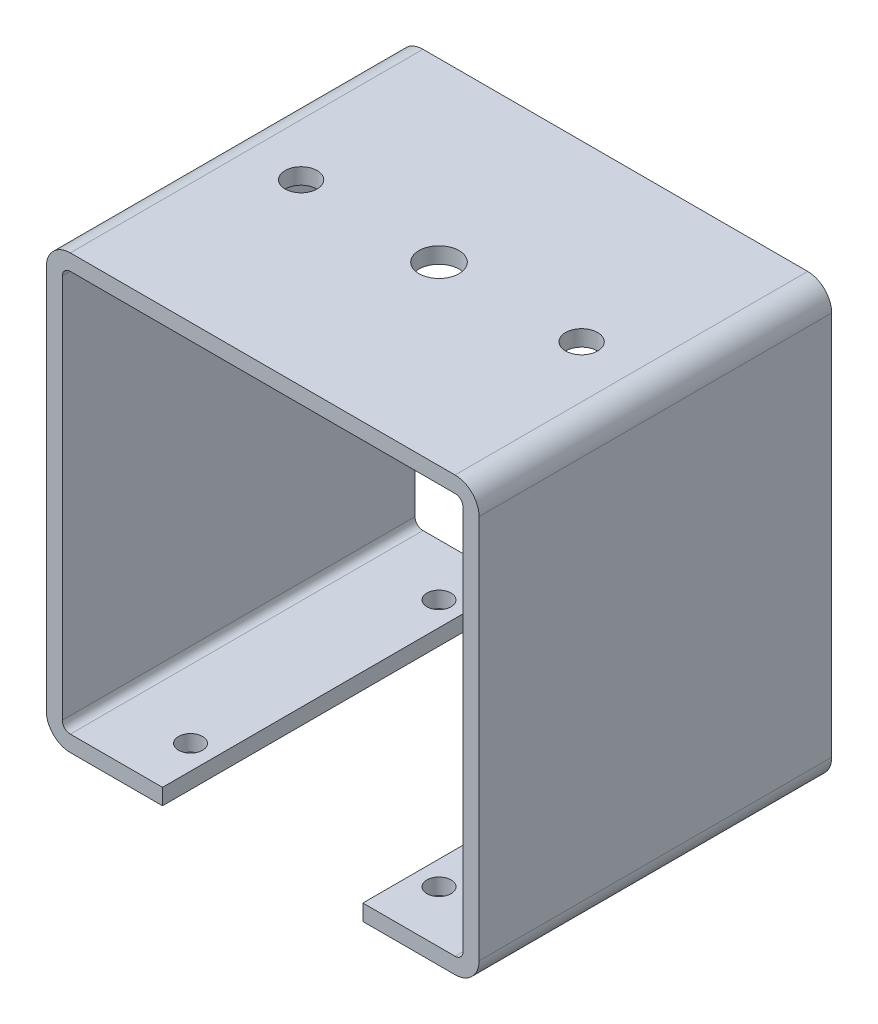
ISO-10303-21;
HEADER;
FILE_DESCRIPTION(('STEP AP214'),'2;1');
FILE_NAME('part.step','',(''),(''),'','','');
FILE_SCHEMA(('AUTOMOTIVE_DESIGN { 1 0 10303 214 1 1 1 1 }'));
ENDSEC;
DATA;
#1=APPLICATION_CONTEXT('core data for automotive mechanical design processes');
#2=APPLICATION_PROTOCOL_DEFINITION('international standard','automotive_design',2000,#1);
#3=PRODUCT_CONTEXT('',#1,'mechanical');
#4=PRODUCT('Part','Part','',(#3));
#5=PRODUCT_RELATED_PRODUCT_CATEGORY('part','',(#4));
#6=PRODUCT_DEFINITION_FORMATION('','',#4);
#7=PRODUCT_DEFINITION_CONTEXT('part definition',#1,'design');
#8=PRODUCT_DEFINITION('design','',#6,#7);
#9=PRODUCT_DEFINITION_SHAPE('','',#8);
#10=(LENGTH_UNIT() NAMED_UNIT(*) SI_UNIT(.MILLI.,.METRE.));
#11=(NAMED_UNIT(*) PLANE_ANGLE_UNIT() SI_UNIT($,.RADIAN.));
#12=(NAMED_UNIT(*) SI_UNIT($,.STERADIAN.) SOLID_ANGLE_UNIT());
#13=UNCERTAINTY_MEASURE_WITH_UNIT(LENGTH_MEASURE(1.E-05),#10,'distance_accuracy_value','');
#14=(GEOMETRIC_REPRESENTATION_CONTEXT(3) GLOBAL_UNCERTAINTY_ASSIGNED_CONTEXT((#13)) GLOBAL_UNIT_ASSIGNED_CONTEXT((#10,
#11,#12)) REPRESENTATION_CONTEXT('',''));
#15=CARTESIAN_POINT('',(0.,0.,0.));
#16=DIRECTION('',(0.,0.,1.));
#17=DIRECTION('',(1.,0.,0.));
#18=AXIS2_PLACEMENT_3D('',#15,#16,#17);
#19=CARTESIAN_POINT('',(-12.5,0.,44.));
#20=DIRECTION('',(-1.,0.,0.));
#21=DIRECTION('',(0.,0.,1.));
#22=AXIS2_PLACEMENT_3D('',#19,#20,#21);
#23=PLANE('',#22);
#24=DIRECTION('',(0.,1.,0.));
#25=VECTOR('',#24,1.);
#26=CARTESIAN_POINT('',(-12.5,0.,0.));
#27=LINE('',#26,#25);
#28=CARTESIAN_POINT('',(-12.5,-2.,0.));
#29=VERTEX_POINT('',#28);
#30=CARTESIAN_POINT('',(-12.5,0.,0.));
#31=VERTEX_POINT('',#30);
#32=EDGE_CURVE('E196',#29,#31,#27,.T.);
#33=ORIENTED_EDGE('',*,*,#32,.T.);
#34=DIRECTION('',(0.,0.,-1.));
#35=VECTOR('',#34,1.);
#36=CARTESIAN_POINT('',(-12.5,0.,44.));
#37=LINE('',#36,#35);
#38=CARTESIAN_POINT('',(-12.5,0.,44.));
#39=VERTEX_POINT('',#38);
#40=EDGE_CURVE('E178',#39,#31,#37,.T.);
#41=ORIENTED_EDGE('',*,*,#40,.F.);
#42=DIRECTION('',(0.,1.,0.));
#43=VECTOR('',#42,1.);
#44=CARTESIAN_POINT('',(-12.5,0.,44.));
#45=LINE('',#44,#43);
#46=CARTESIAN_POINT('',(-12.5,-2.,44.));
#47=VERTEX_POINT('',#46);
#48=EDGE_CURVE('E184',#47,#39,#45,.T.);
#49=ORIENTED_EDGE('',*,*,#48,.F.);
#50=DIRECTION('',(0.,0.,-1.));
#51=VECTOR('',#50,1.);
#52=CARTESIAN_POINT('',(-12.5,-2.,44.));
#53=LINE('',#52,#51);
#54=EDGE_CURVE('E305',#47,#29,#53,.T.);
#55=ORIENTED_EDGE('',*,*,#54,.T.);
#56=EDGE_LOOP('',(#33,#41,#49,#55));
#57=FACE_BOUND('',#56,.T.);
#58=ADVANCED_FACE('F33',(#57),#23,.F.);
#59=CARTESIAN_POINT('',(-25.,0.,44.));
#60=DIRECTION('',(0.,-1.,0.));
#61=DIRECTION('',(0.,0.,-1.));
#62=AXIS2_PLACEMENT_3D('',#59,#60,#61);
#63=PLANE('',#62);
#64=CARTESIAN_POINT('',(-15.5,0.,6.50000000000006));
#65=DIRECTION('',(0.,-1.,0.));
#66=DIRECTION('',(0.,0.,-1.));
#67=AXIS2_PLACEMENT_3D('',#64,#65,#66);
#68=CIRCLE('',#67,1.5);
#69=CARTESIAN_POINT('',(-15.5,0.,5.00000000000006));
#70=VERTEX_POINT('',#69);
#71=EDGE_CURVE('E359',#70,#70,#68,.T.);
#72=ORIENTED_EDGE('',*,*,#71,.T.);
#73=EDGE_LOOP('',(#72));
#74=FACE_BOUND('',#73,.T.);
#75=CARTESIAN_POINT('',(-15.5,0.,37.5));
#76=DIRECTION('',(0.,-1.,0.));
#77=DIRECTION('',(0.,0.,-1.));
#78=AXIS2_PLACEMENT_3D('',#75,#76,#77);
#79=CIRCLE('',#78,1.5);
#80=CARTESIAN_POINT('',(-15.5,0.,36.));
#81=VERTEX_POINT('',#80);
#82=EDGE_CURVE('E324',#81,#81,#79,.T.);
#83=ORIENTED_EDGE('',*,*,#82,.T.);
#84=EDGE_LOOP('',(#83));
#85=FACE_BOUND('',#84,.T.);
#86=DIRECTION('',(-1.,0.,0.));
#87=VECTOR('',#86,1.);
#88=CARTESIAN_POINT('',(-25.,0.,0.));
#89=LINE('',#88,#87);
#90=CARTESIAN_POINT('',(-24.,0.,0.));
#91=VERTEX_POINT('',#90);
#92=EDGE_CURVE('E321',#31,#91,#89,.T.);
#93=ORIENTED_EDGE('',*,*,#92,.T.);
#94=DIRECTION('',(0.,0.,-1.));
#95=VECTOR('',#94,1.);
#96=CARTESIAN_POINT('',(-24.,0.,44.));
#97=LINE('',#96,#95);
#98=CARTESIAN_POINT('',(-24.,0.,44.));
#99=VERTEX_POINT('',#98);
#100=EDGE_CURVE('E181',#91,#99,#97,.F.);
#101=ORIENTED_EDGE('',*,*,#100,.T.);
#102=DIRECTION('',(-1.,0.,0.));
#103=VECTOR('',#102,1.);
#104=CARTESIAN_POINT('',(-25.,0.,44.));
#105=LINE('',#104,#103);
#106=EDGE_CURVE('E173',#39,#99,#105,.T.);
#107=ORIENTED_EDGE('',*,*,#106,.F.);
#108=ORIENTED_EDGE('',*,*,#40,.T.);
#109=EDGE_LOOP('',(#93,#101,#107,#108));
#110=FACE_BOUND('',#109,.T.);
#111=ADVANCED_FACE('F176',(#74,#85,#110),#63,.F.);
#112=CARTESIAN_POINT('',(-25.,50.,44.));
#113=DIRECTION('',(-1.,0.,0.));
#114=DIRECTION('',(0.,-1.,0.));
#115=AXIS2_PLACEMENT_3D('',#112,#113,#114);
#116=PLANE('',#115);
#117=DIRECTION('',(0.,1.,0.));
#118=VECTOR('',#117,1.);
#119=CARTESIAN_POINT('',(-25.,50.,0.));
#120=LINE('',#119,#118);
#121=CARTESIAN_POINT('',(-25.,1.,0.));
#122=VERTEX_POINT('',#121);
#123=CARTESIAN_POINT('',(-25.,49.,0.));
#124=VERTEX_POINT('',#123);
#125=EDGE_CURVE('E318',#122,#124,#120,.T.);
#126=ORIENTED_EDGE('',*,*,#125,.T.);
#127=DIRECTION('',(0.,0.,-1.));
#128=VECTOR('',#127,1.);
#129=CARTESIAN_POINT('',(-25.,49.,44.));
#130=LINE('',#129,#128);
#131=CARTESIAN_POINT('',(-25.,49.,44.));
#132=VERTEX_POINT('',#131);
#133=EDGE_CURVE('E212',#124,#132,#130,.F.);
#134=ORIENTED_EDGE('',*,*,#133,.T.);
#135=DIRECTION('',(0.,1.,0.));
#136=VECTOR('',#135,1.);
#137=CARTESIAN_POINT('',(-25.,50.,44.));
#138=LINE('',#137,#136);
#139=CARTESIAN_POINT('',(-25.,1.,44.));
#140=VERTEX_POINT('',#139);
#141=EDGE_CURVE('E183',#140,#132,#138,.T.);
#142=ORIENTED_EDGE('',*,*,#141,.F.);
#143=DIRECTION('',(0.,0.,-1.));
#144=VECTOR('',#143,1.);
#145=CARTESIAN_POINT('',(-25.,1.,0.));
#146=LINE('',#145,#144);
#147=EDGE_CURVE('E209',#140,#122,#146,.T.);
#148=ORIENTED_EDGE('',*,*,#147,.T.);
#149=EDGE_LOOP('',(#126,#134,#142,#148));
#150=FACE_BOUND('',#149,.T.);
#151=ADVANCED_FACE('F418',(#150),#116,.F.);
#152=CARTESIAN_POINT('',(-25.,50.,44.));
#153=DIRECTION('',(0.,1.,0.));
#154=DIRECTION('',(-1.,0.,0.));
#155=AXIS2_PLACEMENT_3D('',#152,#153,#154);
#156=PLANE('',#155);
#157=CARTESIAN_POINT('',(17.5,50.,21.7049160569581));
#158=DIRECTION('',(0.,1.,0.));
#159=DIRECTION('',(-1.,0.,0.));
#160=AXIS2_PLACEMENT_3D('',#157,#158,#159);
#161=CIRCLE('',#160,2.);
#162=CARTESIAN_POINT('',(15.5,50.,21.7049160569581));
#163=VERTEX_POINT('',#162);
#164=EDGE_CURVE('E377',#163,#163,#161,.T.);
#165=ORIENTED_EDGE('',*,*,#164,.T.);
#166=EDGE_LOOP('',(#165));
#167=FACE_BOUND('',#166,.T.);
#168=CARTESIAN_POINT('',(-17.5,50.,21.7049160569581));
#169=DIRECTION('',(0.,1.,0.));
#170=DIRECTION('',(-1.,0.,0.));
#171=AXIS2_PLACEMENT_3D('',#168,#169,#170);
#172=CIRCLE('',#171,2.);
#173=CARTESIAN_POINT('',(-19.5,50.,21.7049160569581));
#174=VERTEX_POINT('',#173);
#175=EDGE_CURVE('E369',#174,#174,#172,.T.);
#176=ORIENTED_EDGE('',*,*,#175,.T.);
#177=EDGE_LOOP('',(#176));
#178=FACE_BOUND('',#177,.T.);
#179=CARTESIAN_POINT('',(0.,50.,22.));
#180=DIRECTION('',(0.,-1.,0.));
#181=DIRECTION('',(1.,0.,0.));
#182=AXIS2_PLACEMENT_3D('',#179,#180,#181);
#183=CIRCLE('',#182,2.5);
#184=CARTESIAN_POINT('',(2.49999999999999,50.,22.));
#185=VERTEX_POINT('',#184);
#186=EDGE_CURVE('E366',#185,#185,#183,.T.);
#187=ORIENTED_EDGE('',*,*,#186,.F.);
#188=EDGE_LOOP('',(#187));
#189=FACE_BOUND('',#188,.T.);
#190=DIRECTION('',(1.,0.,0.));
#191=VECTOR('',#190,1.);
#192=CARTESIAN_POINT('',(-25.,50.,44.));
#193=LINE('',#192,#191);
#194=CARTESIAN_POINT('',(-24.,50.,44.));
#195=VERTEX_POINT('',#194);
#196=CARTESIAN_POINT('',(24.,50.,44.));
#197=VERTEX_POINT('',#196);
#198=EDGE_CURVE('E337',#195,#197,#193,.T.);
#199=ORIENTED_EDGE('',*,*,#198,.F.);
#200=DIRECTION('',(0.,0.,-1.));
#201=VECTOR('',#200,1.);
#202=CARTESIAN_POINT('',(-24.,50.,0.));
#203=LINE('',#202,#201);
#204=CARTESIAN_POINT('',(-24.,50.,0.));
#205=VERTEX_POINT('',#204);
#206=EDGE_CURVE('E200',#195,#205,#203,.T.);
#207=ORIENTED_EDGE('',*,*,#206,.T.);
#208=DIRECTION('',(1.,0.,0.));
#209=VECTOR('',#208,1.);
#210=CARTESIAN_POINT('',(-25.,50.,0.));
#211=LINE('',#210,#209);
#212=CARTESIAN_POINT('',(24.,50.,0.));
#213=VERTEX_POINT('',#212);
#214=EDGE_CURVE('E315',#205,#213,#211,.T.);
#215=ORIENTED_EDGE('',*,*,#214,.T.);
#216=DIRECTION('',(0.,0.,-1.));
#217=VECTOR('',#216,1.);
#218=CARTESIAN_POINT('',(24.,50.,44.));
#219=LINE('',#218,#217);
#220=EDGE_CURVE('E197',#213,#197,#219,.F.);
#221=ORIENTED_EDGE('',*,*,#220,.T.);
#222=EDGE_LOOP('',(#199,#207,#215,#221));
#223=FACE_BOUND('',#222,.T.);
#224=ADVANCED_FACE('F426',(#167,#178,#189,#223),#156,.F.);
#225=CARTESIAN_POINT('',(25.,0.,44.));
#226=DIRECTION('',(1.,0.,0.));
#227=DIRECTION('',(0.,1.,0.));
#228=AXIS2_PLACEMENT_3D('',#225,#226,#227);
#229=PLANE('',#228);
#230=DIRECTION('',(0.,-1.,0.));
#231=VECTOR('',#230,1.);
#232=CARTESIAN_POINT('',(25.,0.,44.));
#233=LINE('',#232,#231);
#234=CARTESIAN_POINT('',(25.,49.,44.));
#235=VERTEX_POINT('',#234);
#236=CARTESIAN_POINT('',(25.,1.,44.));
#237=VERTEX_POINT('',#236);
#238=EDGE_CURVE('E334',#235,#237,#233,.T.);
#239=ORIENTED_EDGE('',*,*,#238,.F.);
#240=DIRECTION('',(0.,0.,-1.));
#241=VECTOR('',#240,1.);
#242=CARTESIAN_POINT('',(25.,49.,0.));
#243=LINE('',#242,#241);
#244=CARTESIAN_POINT('',(25.,49.,0.));
#245=VERTEX_POINT('',#244);
#246=EDGE_CURVE('E216',#235,#245,#243,.T.);
#247=ORIENTED_EDGE('',*,*,#246,.T.);
#248=DIRECTION('',(0.,-1.,0.));
#249=VECTOR('',#248,1.);
#250=CARTESIAN_POINT('',(25.,0.,0.));
#251=LINE('',#250,#249);
#252=CARTESIAN_POINT('',(25.,1.,0.));
#253=VERTEX_POINT('',#252);
#254=EDGE_CURVE('E310',#245,#253,#251,.T.);
#255=ORIENTED_EDGE('',*,*,#254,.T.);
#256=DIRECTION('',(0.,0.,-1.));
#257=VECTOR('',#256,1.);
#258=CARTESIAN_POINT('',(25.,1.,44.));
#259=LINE('',#258,#257);
#260=EDGE_CURVE('E214',#253,#237,#259,.F.);
#261=ORIENTED_EDGE('',*,*,#260,.T.);
#262=EDGE_LOOP('',(#239,#247,#255,#261));
#263=FACE_BOUND('',#262,.T.);
#264=ADVANCED_FACE('F435',(#263),#229,.F.);
#265=CARTESIAN_POINT('',(12.5,0.,44.));
#266=DIRECTION('',(0.,-1.,0.));
#267=DIRECTION('',(0.,0.,-1.));
#268=AXIS2_PLACEMENT_3D('',#265,#266,#267);
#269=PLANE('',#268);
#270=CARTESIAN_POINT('',(15.5,0.,6.50000000000006));
#271=DIRECTION('',(0.,-1.,0.));
#272=DIRECTION('',(0.,0.,-1.));
#273=AXIS2_PLACEMENT_3D('',#270,#271,#272);
#274=CIRCLE('',#273,1.5);
#275=CARTESIAN_POINT('',(15.5,0.,5.00000000000006));
#276=VERTEX_POINT('',#275);
#277=EDGE_CURVE('E353',#276,#276,#274,.T.);
#278=ORIENTED_EDGE('',*,*,#277,.T.);
#279=EDGE_LOOP('',(#278));
#280=FACE_BOUND('',#279,.T.);
#281=CARTESIAN_POINT('',(15.5,0.,37.5));
#282=DIRECTION('',(0.,-1.,0.));
#283=DIRECTION('',(0.,0.,-1.));
#284=AXIS2_PLACEMENT_3D('',#281,#282,#283);
#285=CIRCLE('',#284,1.5);
#286=CARTESIAN_POINT('',(15.5,0.,36.));
#287=VERTEX_POINT('',#286);
#288=EDGE_CURVE('E347',#287,#287,#285,.T.);
#289=ORIENTED_EDGE('',*,*,#288,.T.);
#290=EDGE_LOOP('',(#289));
#291=FACE_BOUND('',#290,.T.);
#292=DIRECTION('',(-1.,0.,0.));
#293=VECTOR('',#292,1.);
#294=CARTESIAN_POINT('',(12.5,0.,44.));
#295=LINE('',#294,#293);
#296=CARTESIAN_POINT('',(24.,0.,44.));
#297=VERTEX_POINT('',#296);
#298=CARTESIAN_POINT('',(12.5,0.,44.));
#299=VERTEX_POINT('',#298);
#300=EDGE_CURVE('E332',#297,#299,#295,.T.);
#301=ORIENTED_EDGE('',*,*,#300,.F.);
#302=DIRECTION('',(0.,0.,-1.));
#303=VECTOR('',#302,1.);
#304=CARTESIAN_POINT('',(24.,0.,0.));
#305=LINE('',#304,#303);
#306=CARTESIAN_POINT('',(24.,0.,0.));
#307=VERTEX_POINT('',#306);
#308=EDGE_CURVE('E219',#297,#307,#305,.T.);
#309=ORIENTED_EDGE('',*,*,#308,.T.);
#310=DIRECTION('',(-1.,0.,0.));
#311=VECTOR('',#310,1.);
#312=CARTESIAN_POINT('',(12.5,0.,0.));
#313=LINE('',#312,#311);
#314=CARTESIAN_POINT('',(12.5,0.,0.));
#315=VERTEX_POINT('',#314);
#316=EDGE_CURVE('E309',#307,#315,#313,.T.);
#317=ORIENTED_EDGE('',*,*,#316,.T.);
#318=DIRECTION('',(0.,0.,-1.));
#319=VECTOR('',#318,1.);
#320=CARTESIAN_POINT('',(12.5,0.,44.));
#321=LINE('',#320,#319);
#322=EDGE_CURVE('E198',#299,#315,#321,.T.);
#323=ORIENTED_EDGE('',*,*,#322,.F.);
#324=EDGE_LOOP('',(#301,#309,#317,#323));
#325=FACE_BOUND('',#324,.T.);
#326=ADVANCED_FACE('F444',(#280,#291,#325),#269,.F.);
#327=CARTESIAN_POINT('',(12.5,-2.,44.));
#328=DIRECTION('',(1.,0.,0.));
#329=DIRECTION('',(0.,0.,-1.));
#330=AXIS2_PLACEMENT_3D('',#327,#328,#329);
#331=PLANE('',#330);
#332=DIRECTION('',(0.,-1.,0.));
#333=VECTOR('',#332,1.);
#334=CARTESIAN_POINT('',(12.5,-2.,0.));
#335=LINE('',#334,#333);
#336=CARTESIAN_POINT('',(12.5,-2.,0.));
#337=VERTEX_POINT('',#336);
#338=EDGE_CURVE('E298',#315,#337,#335,.T.);
#339=ORIENTED_EDGE('',*,*,#338,.T.);
#340=DIRECTION('',(0.,0.,-1.));
#341=VECTOR('',#340,1.);
#342=CARTESIAN_POINT('',(12.5,-2.,44.));
#343=LINE('',#342,#341);
#344=CARTESIAN_POINT('',(12.5,-2.,44.));
#345=VERTEX_POINT('',#344);
#346=EDGE_CURVE('E203',#345,#337,#343,.T.);
#347=ORIENTED_EDGE('',*,*,#346,.F.);
#348=DIRECTION('',(0.,-1.,0.));
#349=VECTOR('',#348,1.);
#350=CARTESIAN_POINT('',(12.5,-2.,44.));
#351=LINE('',#350,#349);
#352=EDGE_CURVE('E280',#299,#345,#351,.T.);
#353=ORIENTED_EDGE('',*,*,#352,.F.);
#354=ORIENTED_EDGE('',*,*,#322,.T.);
#355=EDGE_LOOP('',(#339,#347,#353,#354));
#356=FACE_BOUND('',#355,.T.);
#357=ADVANCED_FACE('F445',(#356),#331,.F.);
#358=CARTESIAN_POINT('',(27.,-2.,44.));
#359=DIRECTION('',(0.,1.,0.));
#360=DIRECTION('',(-1.,0.,0.));
#361=AXIS2_PLACEMENT_3D('',#358,#359,#360);
#362=PLANE('',#361);
#363=CARTESIAN_POINT('',(15.5,-2.,6.50000000000006));
#364=DIRECTION('',(0.,-1.,0.));
#365=DIRECTION('',(1.,0.,0.));
#366=AXIS2_PLACEMENT_3D('',#363,#364,#365);
#367=CIRCLE('',#366,1.5);
#368=CARTESIAN_POINT('',(17.,-2.,6.50000000000006));
#369=VERTEX_POINT('',#368);
#370=EDGE_CURVE('E356',#369,#369,#367,.T.);
#371=ORIENTED_EDGE('',*,*,#370,.F.);
#372=EDGE_LOOP('',(#371));
#373=FACE_BOUND('',#372,.T.);
#374=CARTESIAN_POINT('',(15.5,-2.,37.5));
#375=DIRECTION('',(0.,-1.,0.));
#376=DIRECTION('',(1.,0.,0.));
#377=AXIS2_PLACEMENT_3D('',#374,#375,#376);
#378=CIRCLE('',#377,1.5);
#379=CARTESIAN_POINT('',(17.,-2.,37.5));
#380=VERTEX_POINT('',#379);
#381=EDGE_CURVE('E350',#380,#380,#378,.T.);
#382=ORIENTED_EDGE('',*,*,#381,.F.);
#383=EDGE_LOOP('',(#382));
#384=FACE_BOUND('',#383,.T.);
#385=DIRECTION('',(1.,0.,0.));
#386=VECTOR('',#385,1.);
#387=CARTESIAN_POINT('',(27.,-2.,0.));
#388=LINE('',#387,#386);
#389=CARTESIAN_POINT('',(24.,-2.,0.));
#390=VERTEX_POINT('',#389);
#391=EDGE_CURVE('E276',#337,#390,#388,.T.);
#392=ORIENTED_EDGE('',*,*,#391,.T.);
#393=DIRECTION('',(0.,0.,-1.));
#394=VECTOR('',#393,1.);
#395=CARTESIAN_POINT('',(24.,-2.,44.));
#396=LINE('',#395,#394);
#397=CARTESIAN_POINT('',(24.,-2.,44.));
#398=VERTEX_POINT('',#397);
#399=EDGE_CURVE('E41',#390,#398,#396,.F.);
#400=ORIENTED_EDGE('',*,*,#399,.T.);
#401=DIRECTION('',(1.,0.,0.));
#402=VECTOR('',#401,1.);
#403=CARTESIAN_POINT('',(27.,-2.,44.));
#404=LINE('',#403,#402);
#405=EDGE_CURVE('E274',#345,#398,#404,.T.);
#406=ORIENTED_EDGE('',*,*,#405,.F.);
#407=ORIENTED_EDGE('',*,*,#346,.T.);
#408=EDGE_LOOP('',(#392,#400,#406,#407));
#409=FACE_BOUND('',#408,.T.);
#410=ADVANCED_FACE('F272',(#373,#384,#409),#362,.F.);
#411=CARTESIAN_POINT('',(27.,52.,44.));
#412=DIRECTION('',(-1.,0.,0.));
#413=DIRECTION('',(0.,-1.,0.));
#414=AXIS2_PLACEMENT_3D('',#411,#412,#413);
#415=PLANE('',#414);
#416=DIRECTION('',(0.,1.,0.));
#417=VECTOR('',#416,1.);
#418=CARTESIAN_POINT('',(27.,52.,0.));
#419=LINE('',#418,#417);
#420=CARTESIAN_POINT('',(27.,1.,0.));
#421=VERTEX_POINT('',#420);
#422=CARTESIAN_POINT('',(27.,49.,0.));
#423=VERTEX_POINT('',#422);
#424=EDGE_CURVE('E288',#421,#423,#419,.T.);
#425=ORIENTED_EDGE('',*,*,#424,.T.);
#426=DIRECTION('',(0.,0.,-1.));
#427=VECTOR('',#426,1.);
#428=CARTESIAN_POINT('',(27.,49.,44.));
#429=LINE('',#428,#427);
#430=CARTESIAN_POINT('',(27.,49.,44.));
#431=VERTEX_POINT('',#430);
#432=EDGE_CURVE('E56',#423,#431,#429,.F.);
#433=ORIENTED_EDGE('',*,*,#432,.T.);
#434=DIRECTION('',(0.,1.,0.));
#435=VECTOR('',#434,1.);
#436=CARTESIAN_POINT('',(27.,52.,44.));
#437=LINE('',#436,#435);
#438=CARTESIAN_POINT('',(27.,1.,44.));
#439=VERTEX_POINT('',#438);
#440=EDGE_CURVE('E282',#439,#431,#437,.T.);
#441=ORIENTED_EDGE('',*,*,#440,.F.);
#442=DIRECTION('',(0.,0.,-1.));
#443=VECTOR('',#442,1.);
#444=CARTESIAN_POINT('',(27.,1.,44.));
#445=LINE('',#444,#443);
#446=EDGE_CURVE('E264',#439,#421,#445,.T.);
#447=ORIENTED_EDGE('',*,*,#446,.T.);
#448=EDGE_LOOP('',(#425,#433,#441,#447));
#449=FACE_BOUND('',#448,.T.);
#450=ADVANCED_FACE('F287',(#449),#415,.F.);
#451=CARTESIAN_POINT('',(-27.,52.,44.));
#452=DIRECTION('',(0.,-1.,0.));
#453=DIRECTION('',(0.,0.,-1.));
#454=AXIS2_PLACEMENT_3D('',#451,#452,#453);
#455=PLANE('',#454);
#456=CARTESIAN_POINT('',(17.5,52.,21.7049160569581));
#457=DIRECTION('',(0.,1.,0.));
#458=DIRECTION('',(0.,0.,-1.));
#459=AXIS2_PLACEMENT_3D('',#456,#457,#458);
#460=CIRCLE('',#459,2.);
#461=CARTESIAN_POINT('',(17.5,52.,19.7049160569581));
#462=VERTEX_POINT('',#461);
#463=EDGE_CURVE('E380',#462,#462,#460,.T.);
#464=ORIENTED_EDGE('',*,*,#463,.F.);
#465=EDGE_LOOP('',(#464));
#466=FACE_BOUND('',#465,.T.);
#467=CARTESIAN_POINT('',(-17.5,52.,21.7049160569581));
#468=DIRECTION('',(0.,1.,0.));
#469=DIRECTION('',(0.,0.,1.));
#470=AXIS2_PLACEMENT_3D('',#467,#468,#469);
#471=CIRCLE('',#470,2.);
#472=CARTESIAN_POINT('',(-17.5,52.,23.7049160569581));
#473=VERTEX_POINT('',#472);
#474=EDGE_CURVE('E374',#473,#473,#471,.T.);
#475=ORIENTED_EDGE('',*,*,#474,.F.);
#476=EDGE_LOOP('',(#475));
#477=FACE_BOUND('',#476,.T.);
#478=CARTESIAN_POINT('',(0.,52.,22.));
#479=DIRECTION('',(0.,-1.,0.));
#480=DIRECTION('',(1.,0.,0.));
#481=AXIS2_PLACEMENT_3D('',#478,#479,#480);
#482=CIRCLE('',#481,2.5);
#483=CARTESIAN_POINT('',(2.49999999999999,52.,22.));
#484=VERTEX_POINT('',#483);
#485=EDGE_CURVE('E365',#484,#484,#482,.T.);
#486=ORIENTED_EDGE('',*,*,#485,.T.);
#487=EDGE_LOOP('',(#486));
#488=FACE_BOUND('',#487,.T.);
#489=DIRECTION('',(-1.,0.,0.));
#490=VECTOR('',#489,1.);
#491=CARTESIAN_POINT('',(-27.,52.,0.));
#492=LINE('',#491,#490);
#493=CARTESIAN_POINT('',(24.,52.,0.));
#494=VERTEX_POINT('',#493);
#495=CARTESIAN_POINT('',(-24.,52.,0.));
#496=VERTEX_POINT('',#495);
#497=EDGE_CURVE('E293',#494,#496,#492,.T.);
#498=ORIENTED_EDGE('',*,*,#497,.T.);
#499=DIRECTION('',(0.,0.,-1.));
#500=VECTOR('',#499,1.);
#501=CARTESIAN_POINT('',(-24.,52.,44.));
#502=LINE('',#501,#500);
#503=CARTESIAN_POINT('',(-24.,52.,44.));
#504=VERTEX_POINT('',#503);
#505=EDGE_CURVE('E255',#496,#504,#502,.F.);
#506=ORIENTED_EDGE('',*,*,#505,.T.);
#507=DIRECTION('',(-1.,0.,0.));
#508=VECTOR('',#507,1.);
#509=CARTESIAN_POINT('',(-27.,52.,44.));
#510=LINE('',#509,#508);
#511=CARTESIAN_POINT('',(24.,52.,44.));
#512=VERTEX_POINT('',#511);
#513=EDGE_CURVE('E328',#512,#504,#510,.T.);
#514=ORIENTED_EDGE('',*,*,#513,.F.);
#515=DIRECTION('',(0.,0.,-1.));
#516=VECTOR('',#515,1.);
#517=CARTESIAN_POINT('',(24.,52.,44.));
#518=LINE('',#517,#516);
#519=EDGE_CURVE('E252',#512,#494,#518,.T.);
#520=ORIENTED_EDGE('',*,*,#519,.T.);
#521=EDGE_LOOP('',(#498,#506,#514,#520));
#522=FACE_BOUND('',#521,.T.);
#523=ADVANCED_FACE('F387',(#466,#477,#488,#522),#455,.F.);
#524=CARTESIAN_POINT('',(-27.,-2.,44.));
#525=DIRECTION('',(1.,0.,0.));
#526=DIRECTION('',(0.,0.,-1.));
#527=AXIS2_PLACEMENT_3D('',#524,#525,#526);
#528=PLANE('',#527);
#529=DIRECTION('',(0.,-1.,0.));
#530=VECTOR('',#529,1.);
#531=CARTESIAN_POINT('',(-27.,-2.,44.));
#532=LINE('',#531,#530);
#533=CARTESIAN_POINT('',(-27.,49.,44.));
#534=VERTEX_POINT('',#533);
#535=CARTESIAN_POINT('',(-27.,0.999999999999998,44.));
#536=VERTEX_POINT('',#535);
#537=EDGE_CURVE('E326',#534,#536,#532,.T.);
#538=ORIENTED_EDGE('',*,*,#537,.F.);
#539=DIRECTION('',(0.,0.,-1.));
#540=VECTOR('',#539,1.);
#541=CARTESIAN_POINT('',(-27.,49.,44.));
#542=LINE('',#541,#540);
#543=CARTESIAN_POINT('',(-27.,49.,0.));
#544=VERTEX_POINT('',#543);
#545=EDGE_CURVE('E241',#534,#544,#542,.T.);
#546=ORIENTED_EDGE('',*,*,#545,.T.);
#547=DIRECTION('',(0.,-1.,0.));
#548=VECTOR('',#547,1.);
#549=CARTESIAN_POINT('',(-27.,-2.,0.));
#550=LINE('',#549,#548);
#551=CARTESIAN_POINT('',(-27.,0.999999999999998,0.));
#552=VERTEX_POINT('',#551);
#553=EDGE_CURVE('E296',#544,#552,#550,.T.);
#554=ORIENTED_EDGE('',*,*,#553,.T.);
#555=DIRECTION('',(0.,0.,-1.));
#556=VECTOR('',#555,1.);
#557=CARTESIAN_POINT('',(-27.,0.999999999999998,44.));
#558=LINE('',#557,#556);
#559=EDGE_CURVE('E239',#552,#536,#558,.F.);
#560=ORIENTED_EDGE('',*,*,#559,.T.);
#561=EDGE_LOOP('',(#538,#546,#554,#560));
#562=FACE_BOUND('',#561,.T.);
#563=ADVANCED_FACE('F390',(#562),#528,.F.);
#564=CARTESIAN_POINT('',(-12.5,-2.,44.));
#565=DIRECTION('',(0.,1.,0.));
#566=DIRECTION('',(-1.,0.,0.));
#567=AXIS2_PLACEMENT_3D('',#564,#565,#566);
#568=PLANE('',#567);
#569=CARTESIAN_POINT('',(-15.5,-2.,6.50000000000006));
#570=DIRECTION('',(0.,-1.,0.));
#571=DIRECTION('',(1.,0.,0.));
#572=AXIS2_PLACEMENT_3D('',#569,#570,#571);
#573=CIRCLE('',#572,1.5);
#574=CARTESIAN_POINT('',(-14.,-2.,6.50000000000006));
#575=VERTEX_POINT('',#574);
#576=EDGE_CURVE('E362',#575,#575,#573,.T.);
#577=ORIENTED_EDGE('',*,*,#576,.F.);
#578=EDGE_LOOP('',(#577));
#579=FACE_BOUND('',#578,.T.);
#580=CARTESIAN_POINT('',(-15.5,-2.,37.5));
#581=DIRECTION('',(0.,-1.,0.));
#582=DIRECTION('',(1.,0.,0.));
#583=AXIS2_PLACEMENT_3D('',#580,#581,#582);
#584=CIRCLE('',#583,1.5);
#585=CARTESIAN_POINT('',(-14.,-2.,37.5));
#586=VERTEX_POINT('',#585);
#587=EDGE_CURVE('E344',#586,#586,#584,.T.);
#588=ORIENTED_EDGE('',*,*,#587,.F.);
#589=EDGE_LOOP('',(#588));
#590=FACE_BOUND('',#589,.T.);
#591=DIRECTION('',(1.,0.,0.));
#592=VECTOR('',#591,1.);
#593=CARTESIAN_POINT('',(-12.5,-2.,44.));
#594=LINE('',#593,#592);
#595=CARTESIAN_POINT('',(-24.,-2.,44.));
#596=VERTEX_POINT('',#595);
#597=EDGE_CURVE('E189',#596,#47,#594,.T.);
#598=ORIENTED_EDGE('',*,*,#597,.F.);
#599=DIRECTION('',(0.,0.,-1.));
#600=VECTOR('',#599,1.);
#601=CARTESIAN_POINT('',(-24.,-2.,44.));
#602=LINE('',#601,#600);
#603=CARTESIAN_POINT('',(-24.,-2.,0.));
#604=VERTEX_POINT('',#603);
#605=EDGE_CURVE('E11',#596,#604,#602,.T.);
#606=ORIENTED_EDGE('',*,*,#605,.T.);
#607=DIRECTION('',(1.,0.,0.));
#608=VECTOR('',#607,1.);
#609=CARTESIAN_POINT('',(-12.5,-2.,0.));
#610=LINE('',#609,#608);
#611=EDGE_CURVE('E193',#604,#29,#610,.T.);
#612=ORIENTED_EDGE('',*,*,#611,.T.);
#613=ORIENTED_EDGE('',*,*,#54,.F.);
#614=EDGE_LOOP('',(#598,#606,#612,#613));
#615=FACE_BOUND('',#614,.T.);
#616=ADVANCED_FACE('F410',(#579,#590,#615),#568,.F.);
#617=CARTESIAN_POINT('',(0.,0.,44.));
#618=DIRECTION('',(0.,0.,-1.));
#619=DIRECTION('',(-1.,0.,0.));
#620=AXIS2_PLACEMENT_3D('',#617,#618,#619);
#621=PLANE('',#620);
#622=ORIENTED_EDGE('',*,*,#513,.T.);
#623=CARTESIAN_POINT('',(-24.,49.,44.));
#624=DIRECTION('',(0.,0.,-1.));
#625=DIRECTION('',(-1.,0.,0.));
#626=AXIS2_PLACEMENT_3D('',#623,#624,#625);
#627=CIRCLE('',#626,3.);
#628=EDGE_CURVE('E262',#504,#534,#627,.F.);
#629=ORIENTED_EDGE('',*,*,#628,.T.);
#630=ORIENTED_EDGE('',*,*,#537,.T.);
#631=CARTESIAN_POINT('',(-24.,0.999999999999999,44.));
#632=DIRECTION('',(0.,0.,-1.));
#633=DIRECTION('',(-1.,0.,0.));
#634=AXIS2_PLACEMENT_3D('',#631,#632,#633);
#635=CIRCLE('',#634,3.);
#636=EDGE_CURVE('E48',#536,#596,#635,.F.);
#637=ORIENTED_EDGE('',*,*,#636,.T.);
#638=ORIENTED_EDGE('',*,*,#597,.T.);
#639=ORIENTED_EDGE('',*,*,#48,.T.);
#640=ORIENTED_EDGE('',*,*,#106,.T.);
#641=CARTESIAN_POINT('',(-24.,1.,44.));
#642=DIRECTION('',(0.,0.,-1.));
#643=DIRECTION('',(-1.,0.,0.));
#644=AXIS2_PLACEMENT_3D('',#641,#642,#643);
#645=CIRCLE('',#644,1.);
#646=EDGE_CURVE('E237',#99,#140,#645,.T.);
#647=ORIENTED_EDGE('',*,*,#646,.T.);
#648=ORIENTED_EDGE('',*,*,#141,.T.);
#649=CARTESIAN_POINT('',(-24.,49.,44.));
#650=DIRECTION('',(0.,0.,-1.));
#651=DIRECTION('',(-1.,0.,0.));
#652=AXIS2_PLACEMENT_3D('',#649,#650,#651);
#653=CIRCLE('',#652,1.);
#654=EDGE_CURVE('E225',#132,#195,#653,.T.);
#655=ORIENTED_EDGE('',*,*,#654,.T.);
#656=ORIENTED_EDGE('',*,*,#198,.T.);
#657=CARTESIAN_POINT('',(24.,49.,44.));
#658=DIRECTION('',(0.,0.,-1.));
#659=DIRECTION('',(-1.,0.,0.));
#660=AXIS2_PLACEMENT_3D('',#657,#658,#659);
#661=CIRCLE('',#660,1.);
#662=EDGE_CURVE('E229',#197,#235,#661,.T.);
#663=ORIENTED_EDGE('',*,*,#662,.T.);
#664=ORIENTED_EDGE('',*,*,#238,.T.);
#665=CARTESIAN_POINT('',(24.,1.,44.));
#666=DIRECTION('',(0.,0.,-1.));
#667=DIRECTION('',(-1.,0.,0.));
#668=AXIS2_PLACEMENT_3D('',#665,#666,#667);
#669=CIRCLE('',#668,1.);
#670=EDGE_CURVE('E233',#237,#297,#669,.T.);
#671=ORIENTED_EDGE('',*,*,#670,.T.);
#672=ORIENTED_EDGE('',*,*,#300,.T.);
#673=ORIENTED_EDGE('',*,*,#352,.T.);
#674=ORIENTED_EDGE('',*,*,#405,.T.);
#675=CARTESIAN_POINT('',(24.,1.,44.));
#676=DIRECTION('',(0.,0.,-1.));
#677=DIRECTION('',(-1.,0.,0.));
#678=AXIS2_PLACEMENT_3D('',#675,#676,#677);
#679=CIRCLE('',#678,3.);
#680=EDGE_CURVE('E258',#398,#439,#679,.F.);
#681=ORIENTED_EDGE('',*,*,#680,.T.);
#682=ORIENTED_EDGE('',*,*,#440,.T.);
#683=CARTESIAN_POINT('',(24.,49.,44.));
#684=DIRECTION('',(0.,0.,-1.));
#685=DIRECTION('',(-1.,0.,0.));
#686=AXIS2_PLACEMENT_3D('',#683,#684,#685);
#687=CIRCLE('',#686,3.);
#688=EDGE_CURVE('E260',#431,#512,#687,.F.);
#689=ORIENTED_EDGE('',*,*,#688,.T.);
#690=EDGE_LOOP('',(#622,#629,#630,#637,#638,#639,#640,#647,#648,#655,#656,#663,#664,#671,#672,
#673,#674,#681,#682,#689));
#691=FACE_BOUND('',#690,.T.);
#692=ADVANCED_FACE('F188',(#691),#621,.F.);
#693=CARTESIAN_POINT('',(0.,0.,0.));
#694=DIRECTION('',(0.,0.,-1.));
#695=DIRECTION('',(-1.,0.,0.));
#696=AXIS2_PLACEMENT_3D('',#693,#694,#695);
#697=PLANE('',#696);
#698=ORIENTED_EDGE('',*,*,#553,.F.);
#699=CARTESIAN_POINT('',(-24.,49.,0.));
#700=DIRECTION('',(0.,0.,-1.));
#701=DIRECTION('',(-1.,0.,0.));
#702=AXIS2_PLACEMENT_3D('',#699,#700,#701);
#703=CIRCLE('',#702,3.);
#704=EDGE_CURVE('E250',#544,#496,#703,.T.);
#705=ORIENTED_EDGE('',*,*,#704,.T.);
#706=ORIENTED_EDGE('',*,*,#497,.F.);
#707=CARTESIAN_POINT('',(24.,49.,0.));
#708=DIRECTION('',(0.,0.,-1.));
#709=DIRECTION('',(-1.,0.,0.));
#710=AXIS2_PLACEMENT_3D('',#707,#708,#709);
#711=CIRCLE('',#710,3.);
#712=EDGE_CURVE('E248',#494,#423,#711,.T.);
#713=ORIENTED_EDGE('',*,*,#712,.T.);
#714=ORIENTED_EDGE('',*,*,#424,.F.);
#715=CARTESIAN_POINT('',(24.,1.,0.));
#716=DIRECTION('',(0.,0.,-1.));
#717=DIRECTION('',(-1.,0.,0.));
#718=AXIS2_PLACEMENT_3D('',#715,#716,#717);
#719=CIRCLE('',#718,3.);
#720=EDGE_CURVE('E246',#421,#390,#719,.T.);
#721=ORIENTED_EDGE('',*,*,#720,.T.);
#722=ORIENTED_EDGE('',*,*,#391,.F.);
#723=ORIENTED_EDGE('',*,*,#338,.F.);
#724=ORIENTED_EDGE('',*,*,#316,.F.);
#725=CARTESIAN_POINT('',(24.,1.,0.));
#726=DIRECTION('',(0.,0.,-1.));
#727=DIRECTION('',(-1.,0.,0.));
#728=AXIS2_PLACEMENT_3D('',#725,#726,#727);
#729=CIRCLE('',#728,1.);
#730=EDGE_CURVE('E231',#307,#253,#729,.F.);
#731=ORIENTED_EDGE('',*,*,#730,.T.);
#732=ORIENTED_EDGE('',*,*,#254,.F.);
#733=CARTESIAN_POINT('',(24.,49.,0.));
#734=DIRECTION('',(0.,0.,-1.));
#735=DIRECTION('',(-1.,0.,0.));
#736=AXIS2_PLACEMENT_3D('',#733,#734,#735);
#737=CIRCLE('',#736,1.);
#738=EDGE_CURVE('E227',#245,#213,#737,.F.);
#739=ORIENTED_EDGE('',*,*,#738,.T.);
#740=ORIENTED_EDGE('',*,*,#214,.F.);
#741=CARTESIAN_POINT('',(-24.,49.,0.));
#742=DIRECTION('',(0.,0.,-1.));
#743=DIRECTION('',(-1.,0.,0.));
#744=AXIS2_PLACEMENT_3D('',#741,#742,#743);
#745=CIRCLE('',#744,1.);
#746=EDGE_CURVE('E223',#205,#124,#745,.F.);
#747=ORIENTED_EDGE('',*,*,#746,.T.);
#748=ORIENTED_EDGE('',*,*,#125,.F.);
#749=CARTESIAN_POINT('',(-24.,1.,0.));
#750=DIRECTION('',(0.,0.,-1.));
#751=DIRECTION('',(-1.,0.,0.));
#752=AXIS2_PLACEMENT_3D('',#749,#750,#751);
#753=CIRCLE('',#752,1.);
#754=EDGE_CURVE('E235',#122,#91,#753,.F.);
#755=ORIENTED_EDGE('',*,*,#754,.T.);
#756=ORIENTED_EDGE('',*,*,#92,.F.);
#757=ORIENTED_EDGE('',*,*,#32,.F.);
#758=ORIENTED_EDGE('',*,*,#611,.F.);
#759=CARTESIAN_POINT('',(-24.,0.999999999999999,0.));
#760=DIRECTION('',(0.,0.,-1.));
#761=DIRECTION('',(-1.,0.,0.));
#762=AXIS2_PLACEMENT_3D('',#759,#760,#761);
#763=CIRCLE('',#762,3.);
#764=EDGE_CURVE('E244',#604,#552,#763,.T.);
#765=ORIENTED_EDGE('',*,*,#764,.T.);
#766=EDGE_LOOP('',(#698,#705,#706,#713,#714,#721,#722,#723,#724,#731,#732,#739,#740,#747,#748,
#755,#756,#757,#758,#765));
#767=FACE_BOUND('',#766,.T.);
#768=ADVANCED_FACE('F291',(#767),#697,.T.);
#769=CARTESIAN_POINT('',(-15.5,30.,37.5));
#770=DIRECTION('',(0.,-1.,0.));
#771=DIRECTION('',(1.,0.,0.));
#772=AXIS2_PLACEMENT_3D('',#769,#770,#771);
#773=CYLINDRICAL_SURFACE('',#772,1.5);
#774=ORIENTED_EDGE('',*,*,#587,.T.);
#775=EDGE_LOOP('',(#774));
#776=FACE_BOUND('',#775,.T.);
#777=ORIENTED_EDGE('',*,*,#82,.F.);
#778=EDGE_LOOP('',(#777));
#779=FACE_BOUND('',#778,.T.);
#780=ADVANCED_FACE('F510',(#776,#779),#773,.F.);
#781=CARTESIAN_POINT('',(15.5,30.,37.5));
#782=DIRECTION('',(0.,-1.,0.));
#783=DIRECTION('',(1.,0.,0.));
#784=AXIS2_PLACEMENT_3D('',#781,#782,#783);
#785=CYLINDRICAL_SURFACE('',#784,1.5);
#786=ORIENTED_EDGE('',*,*,#381,.T.);
#787=EDGE_LOOP('',(#786));
#788=FACE_BOUND('',#787,.T.);
#789=ORIENTED_EDGE('',*,*,#288,.F.);
#790=EDGE_LOOP('',(#789));
#791=FACE_BOUND('',#790,.T.);
#792=ADVANCED_FACE('F666',(#788,#791),#785,.F.);
#793=CARTESIAN_POINT('',(15.5,30.,6.50000000000006));
#794=DIRECTION('',(0.,-1.,0.));
#795=DIRECTION('',(1.,0.,0.));
#796=AXIS2_PLACEMENT_3D('',#793,#794,#795);
#797=CYLINDRICAL_SURFACE('',#796,1.5);
#798=ORIENTED_EDGE('',*,*,#370,.T.);
#799=EDGE_LOOP('',(#798));
#800=FACE_BOUND('',#799,.T.);
#801=ORIENTED_EDGE('',*,*,#277,.F.);
#802=EDGE_LOOP('',(#801));
#803=FACE_BOUND('',#802,.T.);
#804=ADVANCED_FACE('F656',(#800,#803),#797,.F.);
#805=CARTESIAN_POINT('',(-15.5,30.,6.50000000000006));
#806=DIRECTION('',(0.,-1.,0.));
#807=DIRECTION('',(1.,0.,0.));
#808=AXIS2_PLACEMENT_3D('',#805,#806,#807);
#809=CYLINDRICAL_SURFACE('',#808,1.5);
#810=ORIENTED_EDGE('',*,*,#576,.T.);
#811=EDGE_LOOP('',(#810));
#812=FACE_BOUND('',#811,.T.);
#813=ORIENTED_EDGE('',*,*,#71,.F.);
#814=EDGE_LOOP('',(#813));
#815=FACE_BOUND('',#814,.T.);
#816=ADVANCED_FACE('F646',(#812,#815),#809,.F.);
#817=CARTESIAN_POINT('',(0.,52.,22.));
#818=DIRECTION('',(0.,-1.,0.));
#819=DIRECTION('',(1.,0.,0.));
#820=AXIS2_PLACEMENT_3D('',#817,#818,#819);
#821=CYLINDRICAL_SURFACE('',#820,2.5);
#822=ORIENTED_EDGE('',*,*,#485,.F.);
#823=EDGE_LOOP('',(#822));
#824=FACE_BOUND('',#823,.T.);
#825=ORIENTED_EDGE('',*,*,#186,.T.);
#826=EDGE_LOOP('',(#825));
#827=FACE_BOUND('',#826,.T.);
#828=ADVANCED_FACE('F636',(#824,#827),#821,.F.);
#829=CARTESIAN_POINT('',(-17.5,8.00000000000002,21.7049160569581));
#830=DIRECTION('',(0.,1.,0.));
#831=DIRECTION('',(0.,0.,1.));
#832=AXIS2_PLACEMENT_3D('',#829,#830,#831);
#833=CYLINDRICAL_SURFACE('',#832,2.);
#834=ORIENTED_EDGE('',*,*,#474,.T.);
#835=EDGE_LOOP('',(#834));
#836=FACE_BOUND('',#835,.T.);
#837=ORIENTED_EDGE('',*,*,#175,.F.);
#838=EDGE_LOOP('',(#837));
#839=FACE_BOUND('',#838,.T.);
#840=ADVANCED_FACE('F627',(#836,#839),#833,.F.);
#841=CARTESIAN_POINT('',(17.5,8.00000000000002,21.7049160569581));
#842=DIRECTION('',(0.,1.,0.));
#843=DIRECTION('',(0.,0.,1.));
#844=AXIS2_PLACEMENT_3D('',#841,#842,#843);
#845=CYLINDRICAL_SURFACE('',#844,2.);
#846=ORIENTED_EDGE('',*,*,#463,.T.);
#847=EDGE_LOOP('',(#846));
#848=FACE_BOUND('',#847,.T.);
#849=ORIENTED_EDGE('',*,*,#164,.F.);
#850=EDGE_LOOP('',(#849));
#851=FACE_BOUND('',#850,.T.);
#852=ADVANCED_FACE('F384',(#848,#851),#845,.F.);
#853=CARTESIAN_POINT('',(-24.,49.,44.));
#854=DIRECTION('',(0.,0.,1.));
#855=DIRECTION('',(1.,0.,0.));
#856=AXIS2_PLACEMENT_3D('',#853,#854,#855);
#857=CYLINDRICAL_SURFACE('',#856,1.);
#858=ORIENTED_EDGE('',*,*,#654,.F.);
#859=ORIENTED_EDGE('',*,*,#133,.F.);
#860=ORIENTED_EDGE('',*,*,#746,.F.);
#861=ORIENTED_EDGE('',*,*,#206,.F.);
#862=EDGE_LOOP('',(#858,#859,#860,#861));
#863=FACE_BOUND('',#862,.T.);
#864=ADVANCED_FACE('F421',(#863),#857,.F.);
#865=CARTESIAN_POINT('',(24.,49.,44.));
#866=DIRECTION('',(0.,0.,1.));
#867=DIRECTION('',(1.,0.,0.));
#868=AXIS2_PLACEMENT_3D('',#865,#866,#867);
#869=CYLINDRICAL_SURFACE('',#868,1.);
#870=ORIENTED_EDGE('',*,*,#662,.F.);
#871=ORIENTED_EDGE('',*,*,#220,.F.);
#872=ORIENTED_EDGE('',*,*,#738,.F.);
#873=ORIENTED_EDGE('',*,*,#246,.F.);
#874=EDGE_LOOP('',(#870,#871,#872,#873));
#875=FACE_BOUND('',#874,.T.);
#876=ADVANCED_FACE('F430',(#875),#869,.F.);
#877=CARTESIAN_POINT('',(24.,1.,44.));
#878=DIRECTION('',(0.,0.,1.));
#879=DIRECTION('',(1.,0.,0.));
#880=AXIS2_PLACEMENT_3D('',#877,#878,#879);
#881=CYLINDRICAL_SURFACE('',#880,1.);
#882=ORIENTED_EDGE('',*,*,#670,.F.);
#883=ORIENTED_EDGE('',*,*,#260,.F.);
#884=ORIENTED_EDGE('',*,*,#730,.F.);
#885=ORIENTED_EDGE('',*,*,#308,.F.);
#886=EDGE_LOOP('',(#882,#883,#884,#885));
#887=FACE_BOUND('',#886,.T.);
#888=ADVANCED_FACE('F439',(#887),#881,.F.);
#889=CARTESIAN_POINT('',(-24.,1.,44.));
#890=DIRECTION('',(0.,0.,1.));
#891=DIRECTION('',(1.,0.,0.));
#892=AXIS2_PLACEMENT_3D('',#889,#890,#891);
#893=CYLINDRICAL_SURFACE('',#892,1.);
#894=ORIENTED_EDGE('',*,*,#646,.F.);
#895=ORIENTED_EDGE('',*,*,#100,.F.);
#896=ORIENTED_EDGE('',*,*,#754,.F.);
#897=ORIENTED_EDGE('',*,*,#147,.F.);
#898=EDGE_LOOP('',(#894,#895,#896,#897));
#899=FACE_BOUND('',#898,.T.);
#900=ADVANCED_FACE('F413',(#899),#893,.F.);
#901=CARTESIAN_POINT('',(-24.,49.,44.));
#902=DIRECTION('',(0.,0.,-1.));
#903=DIRECTION('',(-1.,0.,0.));
#904=AXIS2_PLACEMENT_3D('',#901,#902,#903);
#905=CYLINDRICAL_SURFACE('',#904,3.);
#906=ORIENTED_EDGE('',*,*,#628,.F.);
#907=ORIENTED_EDGE('',*,*,#505,.F.);
#908=ORIENTED_EDGE('',*,*,#704,.F.);
#909=ORIENTED_EDGE('',*,*,#545,.F.);
#910=EDGE_LOOP('',(#906,#907,#908,#909));
#911=FACE_BOUND('',#910,.T.);
#912=ADVANCED_FACE('F401',(#911),#905,.T.);
#913=CARTESIAN_POINT('',(24.,49.,44.));
#914=DIRECTION('',(0.,0.,-1.));
#915=DIRECTION('',(-1.,0.,0.));
#916=AXIS2_PLACEMENT_3D('',#913,#914,#915);
#917=CYLINDRICAL_SURFACE('',#916,3.);
#918=ORIENTED_EDGE('',*,*,#688,.F.);
#919=ORIENTED_EDGE('',*,*,#432,.F.);
#920=ORIENTED_EDGE('',*,*,#712,.F.);
#921=ORIENTED_EDGE('',*,*,#519,.F.);
#922=EDGE_LOOP('',(#918,#919,#920,#921));
#923=FACE_BOUND('',#922,.T.);
#924=ADVANCED_FACE('F475',(#923),#917,.T.);
#925=CARTESIAN_POINT('',(24.,1.,44.));
#926=DIRECTION('',(0.,0.,-1.));
#927=DIRECTION('',(-1.,0.,0.));
#928=AXIS2_PLACEMENT_3D('',#925,#926,#927);
#929=CYLINDRICAL_SURFACE('',#928,3.);
#930=ORIENTED_EDGE('',*,*,#680,.F.);
#931=ORIENTED_EDGE('',*,*,#399,.F.);
#932=ORIENTED_EDGE('',*,*,#720,.F.);
#933=ORIENTED_EDGE('',*,*,#446,.F.);
#934=EDGE_LOOP('',(#930,#931,#932,#933));
#935=FACE_BOUND('',#934,.T.);
#936=ADVANCED_FACE('F285',(#935),#929,.T.);
#937=CARTESIAN_POINT('',(-24.,0.999999999999999,44.));
#938=DIRECTION('',(0.,0.,-1.));
#939=DIRECTION('',(-1.,0.,0.));
#940=AXIS2_PLACEMENT_3D('',#937,#938,#939);
#941=CYLINDRICAL_SURFACE('',#940,3.);
#942=ORIENTED_EDGE('',*,*,#636,.F.);
#943=ORIENTED_EDGE('',*,*,#559,.F.);
#944=ORIENTED_EDGE('',*,*,#764,.F.);
#945=ORIENTED_EDGE('',*,*,#605,.F.);
#946=EDGE_LOOP('',(#942,#943,#944,#945));
#947=FACE_BOUND('',#946,.T.);
#948=ADVANCED_FACE('F35',(#947),#941,.T.);
#949=CLOSED_SHELL('',(#58,#111,#151,#224,#264,#326,#357,#410,#450,#523,#563,#616,#692,#768,#780,
#792,#804,#816,#828,#840,#852,#864,#876,#888,#900,#912,#924,#936,#948));
#950=MANIFOLD_SOLID_BREP('B2',#949);
#951=ADVANCED_BREP_SHAPE_REPRESENTATION('',(#18,#950),#14);
#952=SHAPE_DEFINITION_REPRESENTATION(#9,#951);
ENDSEC;
END-ISO-10303-21;
